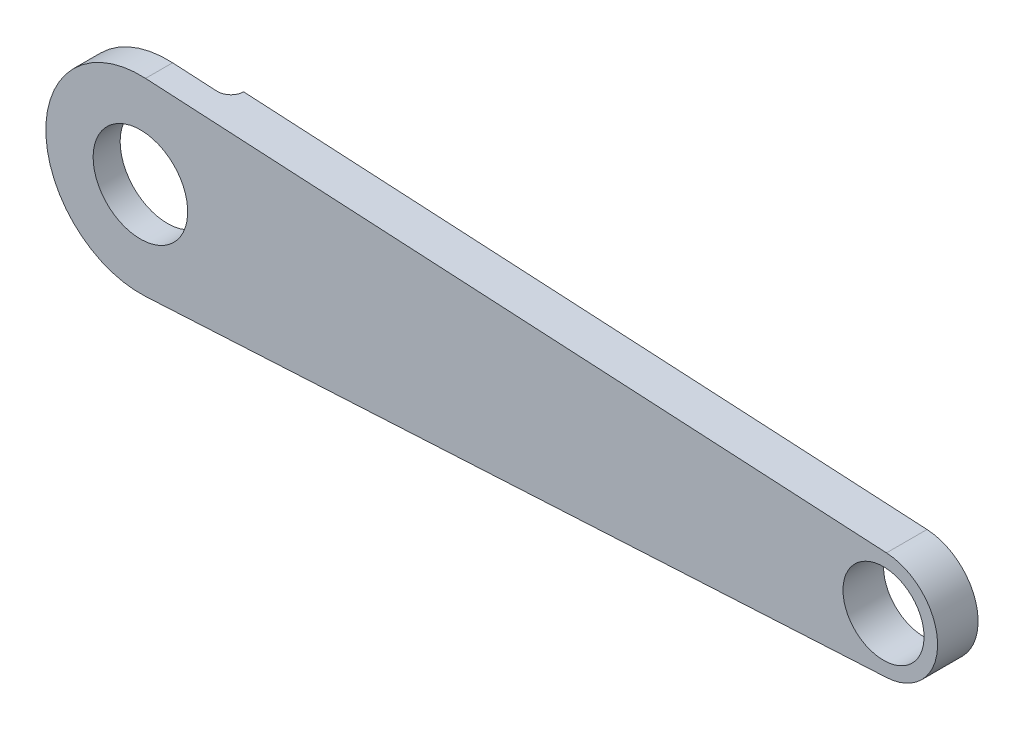
ISO-10303-21;
HEADER;
FILE_DESCRIPTION(('STEP AP214'),'2;1');
FILE_NAME('part.step','',(''),(''),'','','');
FILE_SCHEMA(('AUTOMOTIVE_DESIGN { 1 0 10303 214 1 1 1 1 }'));
ENDSEC;
DATA;
#1=APPLICATION_CONTEXT('core data for automotive mechanical design processes');
#2=APPLICATION_PROTOCOL_DEFINITION('international standard','automotive_design',2000,#1);
#3=PRODUCT_CONTEXT('',#1,'mechanical');
#4=PRODUCT('Part','Part','',(#3));
#5=PRODUCT_RELATED_PRODUCT_CATEGORY('part','',(#4));
#6=PRODUCT_DEFINITION_FORMATION('','',#4);
#7=PRODUCT_DEFINITION_CONTEXT('part definition',#1,'design');
#8=PRODUCT_DEFINITION('design','',#6,#7);
#9=PRODUCT_DEFINITION_SHAPE('','',#8);
#10=(LENGTH_UNIT() NAMED_UNIT(*) SI_UNIT(.MILLI.,.METRE.));
#11=(NAMED_UNIT(*) PLANE_ANGLE_UNIT() SI_UNIT($,.RADIAN.));
#12=(NAMED_UNIT(*) SI_UNIT($,.STERADIAN.) SOLID_ANGLE_UNIT());
#13=UNCERTAINTY_MEASURE_WITH_UNIT(LENGTH_MEASURE(1.E-05),#10,'distance_accuracy_value','');
#14=(GEOMETRIC_REPRESENTATION_CONTEXT(3) GLOBAL_UNCERTAINTY_ASSIGNED_CONTEXT((#13)) GLOBAL_UNIT_ASSIGNED_CONTEXT((#10,
#11,#12)) REPRESENTATION_CONTEXT('',''));
#15=CARTESIAN_POINT('',(0.,0.,0.));
#16=DIRECTION('',(0.,0.,1.));
#17=DIRECTION('',(1.,0.,0.));
#18=AXIS2_PLACEMENT_3D('',#15,#16,#17);
#19=CARTESIAN_POINT('',(698.5,0.,38.1));
#20=DIRECTION('',(0.,0.,1.));
#21=DIRECTION('',(1.,0.,0.));
#22=AXIS2_PLACEMENT_3D('',#19,#20,#21);
#23=PLANE('',#22);
#24=CARTESIAN_POINT('',(-698.5,0.,38.1));
#25=DIRECTION('',(0.,0.,1.));
#26=DIRECTION('',(1.,0.,0.));
#27=AXIS2_PLACEMENT_3D('',#24,#25,#26);
#28=CIRCLE('',#27,88.8999999999999);
#29=CARTESIAN_POINT('',(-787.4,0.,38.1));
#30=VERTEX_POINT('',#29);
#31=EDGE_CURVE('E126',#30,#30,#28,.T.);
#32=ORIENTED_EDGE('',*,*,#31,.F.);
#33=EDGE_LOOP('',(#32));
#34=FACE_BOUND('',#33,.T.);
#35=CARTESIAN_POINT('',(698.5,0.,38.1));
#36=DIRECTION('',(0.,0.,1.));
#37=DIRECTION('',(1.,0.,0.));
#38=AXIS2_PLACEMENT_3D('',#35,#36,#37);
#39=CIRCLE('',#38,101.6);
#40=CARTESIAN_POINT('',(704.041818181818,-101.448746918035,38.1));
#41=VERTEX_POINT('',#40);
#42=CARTESIAN_POINT('',(704.041818181818,101.448746918036,38.1));
#43=VERTEX_POINT('',#42);
#44=EDGE_CURVE('E123',#41,#43,#39,.T.);
#45=ORIENTED_EDGE('',*,*,#44,.T.);
#46=DIRECTION('',(-0.998511288563344,0.0545454545454544,0.));
#47=VECTOR('',#46,1.);
#48=CARTESIAN_POINT('',(-688.801818181818,177.535307106563,38.1));
#49=LINE('',#48,#47);
#50=CARTESIAN_POINT('',(-688.801818181818,177.535307106563,38.1));
#51=VERTEX_POINT('',#50);
#52=EDGE_CURVE('E130',#43,#51,#49,.T.);
#53=ORIENTED_EDGE('',*,*,#52,.T.);
#54=CARTESIAN_POINT('',(-698.5,0.,38.1));
#55=DIRECTION('',(0.,0.,1.));
#56=DIRECTION('',(1.,0.,0.));
#57=AXIS2_PLACEMENT_3D('',#54,#55,#56);
#58=CIRCLE('',#57,177.8);
#59=CARTESIAN_POINT('',(-688.801818181818,-177.535307106562,38.1));
#60=VERTEX_POINT('',#59);
#61=EDGE_CURVE('E128',#51,#60,#58,.T.);
#62=ORIENTED_EDGE('',*,*,#61,.T.);
#63=DIRECTION('',(0.998511288563344,0.0545454545454547,0.));
#64=VECTOR('',#63,1.);
#65=CARTESIAN_POINT('',(-688.801818181818,-177.535307106562,38.1));
#66=LINE('',#65,#64);
#67=EDGE_CURVE('E122',#60,#41,#66,.T.);
#68=ORIENTED_EDGE('',*,*,#67,.T.);
#69=EDGE_LOOP('',(#45,#53,#62,#68));
#70=FACE_BOUND('',#69,.T.);
#71=CARTESIAN_POINT('',(698.5,0.,38.1));
#72=DIRECTION('',(0.,0.,1.));
#73=DIRECTION('',(1.,0.,0.));
#74=AXIS2_PLACEMENT_3D('',#71,#72,#73);
#75=CIRCLE('',#74,76.2000000000001);
#76=CARTESIAN_POINT('',(622.3,0.,38.1));
#77=VERTEX_POINT('',#76);
#78=EDGE_CURVE('E136',#77,#77,#75,.T.);
#79=ORIENTED_EDGE('',*,*,#78,.F.);
#80=EDGE_LOOP('',(#79));
#81=FACE_BOUND('',#80,.T.);
#82=ADVANCED_FACE('F37',(#34,#70,#81),#23,.T.);
#83=CARTESIAN_POINT('',(698.5,0.,-38.1));
#84=DIRECTION('',(0.,0.,1.));
#85=DIRECTION('',(1.,0.,0.));
#86=AXIS2_PLACEMENT_3D('',#83,#84,#85);
#87=PLANE('',#86);
#88=DIRECTION('',(0.998511288563344,0.0545454545454547,0.));
#89=VECTOR('',#88,1.);
#90=CARTESIAN_POINT('',(-688.801818181818,-177.535307106562,-38.1));
#91=LINE('',#90,#89);
#92=CARTESIAN_POINT('',(-561.990884534273,-170.60803437929,-38.1));
#93=VERTEX_POINT('',#92);
#94=CARTESIAN_POINT('',(704.041818181818,-101.448746918035,-38.1));
#95=VERTEX_POINT('',#94);
#96=EDGE_CURVE('E94',#93,#95,#91,.T.);
#97=ORIENTED_EDGE('',*,*,#96,.F.);
#98=DIRECTION('',(0.0545454545454547,-0.998511288563344,0.));
#99=VECTOR('',#98,1.);
#100=CARTESIAN_POINT('',(-581.901802111987,193.88202501573,-38.1));
#101=LINE('',#100,#99);
#102=CARTESIAN_POINT('',(-580.686207421409,171.629299633306,-38.1));
#103=VERTEX_POINT('',#102);
#104=EDGE_CURVE('E88',#103,#93,#101,.T.);
#105=ORIENTED_EDGE('',*,*,#104,.F.);
#106=DIRECTION('',(-0.998511288563344,0.0545454545454544,0.));
#107=VECTOR('',#106,1.);
#108=CARTESIAN_POINT('',(-688.801818181818,177.535307106563,-38.1));
#109=LINE('',#108,#107);
#110=CARTESIAN_POINT('',(704.041818181818,101.448746918036,-38.1));
#111=VERTEX_POINT('',#110);
#112=EDGE_CURVE('E92',#111,#103,#109,.T.);
#113=ORIENTED_EDGE('',*,*,#112,.F.);
#114=CARTESIAN_POINT('',(698.5,0.,-38.1));
#115=DIRECTION('',(0.,0.,1.));
#116=DIRECTION('',(1.,0.,0.));
#117=AXIS2_PLACEMENT_3D('',#114,#115,#116);
#118=CIRCLE('',#117,101.6);
#119=EDGE_CURVE('E101',#95,#111,#118,.T.);
#120=ORIENTED_EDGE('',*,*,#119,.F.);
#121=EDGE_LOOP('',(#97,#105,#113,#120));
#122=FACE_BOUND('',#121,.T.);
#123=CARTESIAN_POINT('',(698.5,0.,-38.1));
#124=DIRECTION('',(0.,0.,1.));
#125=DIRECTION('',(1.,0.,0.));
#126=AXIS2_PLACEMENT_3D('',#123,#124,#125);
#127=CIRCLE('',#126,76.2000000000001);
#128=CARTESIAN_POINT('',(622.3,0.,-38.1));
#129=VERTEX_POINT('',#128);
#130=EDGE_CURVE('E137',#129,#129,#127,.T.);
#131=ORIENTED_EDGE('',*,*,#130,.T.);
#132=EDGE_LOOP('',(#131));
#133=FACE_BOUND('',#132,.T.);
#134=ADVANCED_FACE('F89',(#122,#133),#87,.F.);
#135=CARTESIAN_POINT('',(698.5,0.,38.1));
#136=DIRECTION('',(0.,0.,-1.));
#137=DIRECTION('',(-1.,0.,0.));
#138=AXIS2_PLACEMENT_3D('',#135,#136,#137);
#139=CYLINDRICAL_SURFACE('',#138,101.6);
#140=ORIENTED_EDGE('',*,*,#119,.T.);
#141=DIRECTION('',(0.,0.,-1.));
#142=VECTOR('',#141,1.);
#143=CARTESIAN_POINT('',(704.041818181818,101.448746918036,38.1));
#144=LINE('',#143,#142);
#145=EDGE_CURVE('E99',#43,#111,#144,.T.);
#146=ORIENTED_EDGE('',*,*,#145,.F.);
#147=ORIENTED_EDGE('',*,*,#44,.F.);
#148=DIRECTION('',(0.,0.,-1.));
#149=VECTOR('',#148,1.);
#150=CARTESIAN_POINT('',(704.041818181818,-101.448746918035,38.1));
#151=LINE('',#150,#149);
#152=EDGE_CURVE('E119',#41,#95,#151,.T.);
#153=ORIENTED_EDGE('',*,*,#152,.T.);
#154=EDGE_LOOP('',(#140,#146,#147,#153));
#155=FACE_BOUND('',#154,.T.);
#156=ADVANCED_FACE('F161',(#155),#139,.T.);
#157=CARTESIAN_POINT('',(-688.801818181818,177.535307106563,38.1));
#158=DIRECTION('',(-0.0545454545454544,-0.998511288563344,0.));
#159=DIRECTION('',(0.998511288563344,-0.0545454545454544,0.));
#160=AXIS2_PLACEMENT_3D('',#157,#158,#159);
#161=PLANE('',#160);
#162=ORIENTED_EDGE('',*,*,#112,.T.);
#163=CARTESIAN_POINT('',(-606.20021302725,173.023047554823,-38.1));
#164=DIRECTION('',(-0.0545454545454544,-0.998511288563344,0.));
#165=DIRECTION('',(-0.998511288563344,0.0545454545454544,0.));
#166=AXIS2_PLACEMENT_3D('',#163,#164,#165);
#167=ELLIPSE('',#166,25.5520452278018,25.4);
#168=CARTESIAN_POINT('',(-606.20021302725,173.023047554823,-12.7));
#169=VERTEX_POINT('',#168);
#170=EDGE_CURVE('E11',#103,#169,#167,.T.);
#171=ORIENTED_EDGE('',*,*,#170,.T.);
#172=DIRECTION('',(-0.998511288563344,0.0545454545454544,0.));
#173=VECTOR('',#172,1.);
#174=CARTESIAN_POINT('',(-688.801818181818,177.535307106563,-12.7));
#175=LINE('',#174,#173);
#176=CARTESIAN_POINT('',(-688.801818181818,177.535307106563,-12.7));
#177=VERTEX_POINT('',#176);
#178=EDGE_CURVE('E140',#169,#177,#175,.T.);
#179=ORIENTED_EDGE('',*,*,#178,.T.);
#180=DIRECTION('',(0.,0.,-1.));
#181=VECTOR('',#180,1.);
#182=CARTESIAN_POINT('',(-688.801818181818,177.535307106563,38.1));
#183=LINE('',#182,#181);
#184=EDGE_CURVE('E108',#51,#177,#183,.T.);
#185=ORIENTED_EDGE('',*,*,#184,.F.);
#186=ORIENTED_EDGE('',*,*,#52,.F.);
#187=ORIENTED_EDGE('',*,*,#145,.T.);
#188=EDGE_LOOP('',(#162,#171,#179,#185,#186,#187));
#189=FACE_BOUND('',#188,.T.);
#190=ADVANCED_FACE('F97',(#189),#161,.F.);
#191=CARTESIAN_POINT('',(-698.5,0.,38.1));
#192=DIRECTION('',(0.,0.,-1.));
#193=DIRECTION('',(-1.,0.,0.));
#194=AXIS2_PLACEMENT_3D('',#191,#192,#193);
#195=CYLINDRICAL_SURFACE('',#194,177.8);
#196=ORIENTED_EDGE('',*,*,#184,.T.);
#197=CARTESIAN_POINT('',(-698.5,0.,-12.7));
#198=DIRECTION('',(0.,0.,1.));
#199=DIRECTION('',(1.,0.,0.));
#200=AXIS2_PLACEMENT_3D('',#197,#198,#199);
#201=CIRCLE('',#200,177.8);
#202=CARTESIAN_POINT('',(-688.801818181818,-177.535307106562,-12.7));
#203=VERTEX_POINT('',#202);
#204=EDGE_CURVE('E144',#177,#203,#201,.T.);
#205=ORIENTED_EDGE('',*,*,#204,.T.);
#206=DIRECTION('',(0.,0.,-1.));
#207=VECTOR('',#206,1.);
#208=CARTESIAN_POINT('',(-688.801818181818,-177.535307106562,38.1));
#209=LINE('',#208,#207);
#210=EDGE_CURVE('E116',#60,#203,#209,.T.);
#211=ORIENTED_EDGE('',*,*,#210,.F.);
#212=ORIENTED_EDGE('',*,*,#61,.F.);
#213=EDGE_LOOP('',(#196,#205,#211,#212));
#214=FACE_BOUND('',#213,.T.);
#215=ADVANCED_FACE('F155',(#214),#195,.T.);
#216=CARTESIAN_POINT('',(-688.801818181818,-177.535307106562,38.1));
#217=DIRECTION('',(-0.0545454545454547,0.998511288563344,0.));
#218=DIRECTION('',(-0.998511288563344,-0.0545454545454547,0.));
#219=AXIS2_PLACEMENT_3D('',#216,#217,#218);
#220=PLANE('',#219);
#221=ORIENTED_EDGE('',*,*,#210,.T.);
#222=DIRECTION('',(0.998511288563344,0.0545454545454547,0.));
#223=VECTOR('',#222,1.);
#224=CARTESIAN_POINT('',(-688.801818181818,-177.535307106562,-12.7));
#225=LINE('',#224,#223);
#226=CARTESIAN_POINT('',(-587.353071263782,-171.993488924744,-12.7));
#227=VERTEX_POINT('',#226);
#228=EDGE_CURVE('E112',#203,#227,#225,.T.);
#229=ORIENTED_EDGE('',*,*,#228,.T.);
#230=CARTESIAN_POINT('',(-587.353071263782,-171.993488924744,-38.1));
#231=DIRECTION('',(-0.0545454545454547,0.998511288563344,0.));
#232=DIRECTION('',(-0.998511288563344,-0.0545454545454547,0.));
#233=AXIS2_PLACEMENT_3D('',#230,#231,#232);
#234=CIRCLE('',#233,25.4);
#235=EDGE_CURVE('E45',#227,#93,#234,.T.);
#236=ORIENTED_EDGE('',*,*,#235,.T.);
#237=ORIENTED_EDGE('',*,*,#96,.T.);
#238=ORIENTED_EDGE('',*,*,#152,.F.);
#239=ORIENTED_EDGE('',*,*,#67,.F.);
#240=EDGE_LOOP('',(#221,#229,#236,#237,#238,#239));
#241=FACE_BOUND('',#240,.T.);
#242=ADVANCED_FACE('F147',(#241),#220,.F.);
#243=CARTESIAN_POINT('',(-698.5,0.,38.1));
#244=DIRECTION('',(0.,0.,-1.));
#245=DIRECTION('',(-1.,0.,0.));
#246=AXIS2_PLACEMENT_3D('',#243,#244,#245);
#247=CYLINDRICAL_SURFACE('',#246,88.8999999999999);
#248=CARTESIAN_POINT('',(-698.5,0.,-12.7));
#249=DIRECTION('',(0.,0.,1.));
#250=DIRECTION('',(1.,0.,0.));
#251=AXIS2_PLACEMENT_3D('',#248,#249,#250);
#252=CIRCLE('',#251,88.8999999999999);
#253=CARTESIAN_POINT('',(-787.4,0.,-12.7));
#254=VERTEX_POINT('',#253);
#255=EDGE_CURVE('E95',#254,#254,#252,.T.);
#256=CARTESIAN_POINT('',(-787.4,0.,-12.7));
#257=CARTESIAN_POINT('',(-787.4,0.,-12.1708333333333));
#258=CARTESIAN_POINT('',(-787.4,0.,-11.6416666666667));
#259=CARTESIAN_POINT('',(-787.4,0.,-10.5833333333333));
#260=CARTESIAN_POINT('',(-787.4,0.,-10.0541666666667));
#261=CARTESIAN_POINT('',(-787.4,0.,-8.99583333333334));
#262=CARTESIAN_POINT('',(-787.4,0.,-8.46666666666667));
#263=CARTESIAN_POINT('',(-787.4,0.,-7.40833333333333));
#264=CARTESIAN_POINT('',(-787.4,0.,-6.87916666666667));
#265=CARTESIAN_POINT('',(-787.4,0.,-5.82083333333333));
#266=CARTESIAN_POINT('',(-787.4,0.,-5.29166666666667));
#267=CARTESIAN_POINT('',(-787.4,0.,-4.23333333333334));
#268=CARTESIAN_POINT('',(-787.4,0.,-3.70416666666667));
#269=CARTESIAN_POINT('',(-787.4,0.,-2.64583333333334));
#270=CARTESIAN_POINT('',(-787.4,0.,-2.11666666666667));
#271=CARTESIAN_POINT('',(-787.4,0.,-1.05833333333334));
#272=CARTESIAN_POINT('',(-787.4,0.,-0.529166666666669));
#273=CARTESIAN_POINT('',(-787.4,0.,0.529166666666666));
#274=CARTESIAN_POINT('',(-787.4,0.,1.05833333333333));
#275=CARTESIAN_POINT('',(-787.4,0.,2.11666666666666));
#276=CARTESIAN_POINT('',(-787.4,0.,2.64583333333333));
#277=CARTESIAN_POINT('',(-787.4,0.,3.70416666666667));
#278=CARTESIAN_POINT('',(-787.4,0.,4.23333333333333));
#279=CARTESIAN_POINT('',(-787.4,0.,5.29166666666667));
#280=CARTESIAN_POINT('',(-787.4,0.,5.82083333333333));
#281=CARTESIAN_POINT('',(-787.4,0.,6.87916666666666));
#282=CARTESIAN_POINT('',(-787.4,0.,7.40833333333333));
#283=CARTESIAN_POINT('',(-787.4,0.,8.46666666666666));
#284=CARTESIAN_POINT('',(-787.4,0.,8.99583333333333));
#285=CARTESIAN_POINT('',(-787.4,0.,10.0541666666667));
#286=CARTESIAN_POINT('',(-787.4,0.,10.5833333333333));
#287=CARTESIAN_POINT('',(-787.4,0.,11.6416666666667));
#288=CARTESIAN_POINT('',(-787.4,0.,12.1708333333333));
#289=CARTESIAN_POINT('',(-787.4,0.,13.2291666666667));
#290=CARTESIAN_POINT('',(-787.4,0.,13.7583333333333));
#291=CARTESIAN_POINT('',(-787.4,0.,14.8166666666667));
#292=CARTESIAN_POINT('',(-787.4,0.,15.3458333333333));
#293=CARTESIAN_POINT('',(-787.4,0.,16.4041666666667));
#294=CARTESIAN_POINT('',(-787.4,0.,16.9333333333333));
#295=CARTESIAN_POINT('',(-787.4,0.,17.9916666666667));
#296=CARTESIAN_POINT('',(-787.4,0.,18.5208333333333));
#297=CARTESIAN_POINT('',(-787.4,0.,19.5791666666667));
#298=CARTESIAN_POINT('',(-787.4,0.,20.1083333333333));
#299=CARTESIAN_POINT('',(-787.4,0.,21.1666666666667));
#300=CARTESIAN_POINT('',(-787.4,0.,21.6958333333333));
#301=CARTESIAN_POINT('',(-787.4,0.,22.7541666666667));
#302=CARTESIAN_POINT('',(-787.4,0.,23.2833333333333));
#303=CARTESIAN_POINT('',(-787.4,0.,24.3416666666667));
#304=CARTESIAN_POINT('',(-787.4,0.,24.8708333333333));
#305=CARTESIAN_POINT('',(-787.4,0.,25.9291666666667));
#306=CARTESIAN_POINT('',(-787.4,0.,26.4583333333333));
#307=CARTESIAN_POINT('',(-787.4,0.,27.5166666666667));
#308=CARTESIAN_POINT('',(-787.4,0.,28.0458333333333));
#309=CARTESIAN_POINT('',(-787.4,0.,29.1041666666667));
#310=CARTESIAN_POINT('',(-787.4,0.,29.6333333333333));
#311=CARTESIAN_POINT('',(-787.4,0.,30.6916666666667));
#312=CARTESIAN_POINT('',(-787.4,0.,31.2208333333333));
#313=CARTESIAN_POINT('',(-787.4,0.,32.2791666666667));
#314=CARTESIAN_POINT('',(-787.4,0.,32.8083333333333));
#315=CARTESIAN_POINT('',(-787.4,0.,33.8666666666667));
#316=CARTESIAN_POINT('',(-787.4,0.,34.3958333333333));
#317=CARTESIAN_POINT('',(-787.4,0.,35.4541666666667));
#318=CARTESIAN_POINT('',(-787.4,0.,35.9833333333333));
#319=CARTESIAN_POINT('',(-787.4,0.,37.0416666666667));
#320=CARTESIAN_POINT('',(-787.4,0.,37.5708333333333));
#321=CARTESIAN_POINT('',(-787.4,0.,38.1));
#322=B_SPLINE_CURVE_WITH_KNOTS('',3,(#256,#257,#258,#259,#260,#261,#262,#263,#264,#265,#266,
#267,#268,#269,#270,#271,#272,#273,#274,#275,#276,#277,#278,#279,#280,#281,#282,#283,#284,#285,
#286,#287,#288,#289,#290,#291,#292,#293,#294,#295,#296,#297,#298,#299,#300,#301,#302,#303,#304,
#305,#306,#307,#308,#309,#310,#311,#312,#313,#314,#315,#316,#317,#318,#319,#320,#321),
.UNSPECIFIED.,.F.,.F.,(4,2,2,2,2,2,2,2,2,2,2,2,2,2,2,2,2,2,2,2,2,2,2,2,2,2,2,2,2,2,2,2,4),(0.,
1.5875,3.175,4.7625,6.35,7.9375,9.525,11.1125,12.7,14.2875,15.875,17.4625,19.05,20.6375,22.225,
23.8125,25.4,26.9875,28.575,30.1625,31.75,33.3375,34.925,36.5125,38.1,39.6875,41.275,42.8625,
44.45,46.0375,47.625,49.2125,50.8),.UNSPECIFIED.);
#323=EDGE_CURVE('BSEAM176',#254,#30,#322,.T.);
#324=ORIENTED_EDGE('',*,*,#255,.F.);
#325=ORIENTED_EDGE('',*,*,#31,.T.);
#326=ORIENTED_EDGE('',*,*,#323,.T.);
#327=ORIENTED_EDGE('',*,*,#323,.F.);
#328=EDGE_LOOP('',(#324,#326,#325,#327));
#329=FACE_BOUND('',#328,.T.);
#330=ADVANCED_FACE('F176',(#329),#247,.F.);
#331=CARTESIAN_POINT('',(698.5,0.,38.1));
#332=DIRECTION('',(0.,0.,-1.));
#333=DIRECTION('',(-1.,0.,0.));
#334=AXIS2_PLACEMENT_3D('',#331,#332,#333);
#335=CYLINDRICAL_SURFACE('',#334,76.2000000000001);
#336=CARTESIAN_POINT('',(622.3,0.,38.1));
#337=CARTESIAN_POINT('',(622.3,0.,37.30625));
#338=CARTESIAN_POINT('',(622.3,0.,36.5125));
#339=CARTESIAN_POINT('',(622.3,0.,34.925));
#340=CARTESIAN_POINT('',(622.3,0.,34.13125));
#341=CARTESIAN_POINT('',(622.3,0.,32.54375));
#342=CARTESIAN_POINT('',(622.3,0.,31.75));
#343=CARTESIAN_POINT('',(622.3,0.,30.1625));
#344=CARTESIAN_POINT('',(622.3,0.,29.36875));
#345=CARTESIAN_POINT('',(622.3,0.,27.78125));
#346=CARTESIAN_POINT('',(622.3,0.,26.9875));
#347=CARTESIAN_POINT('',(622.3,0.,25.4));
#348=CARTESIAN_POINT('',(622.3,0.,24.60625));
#349=CARTESIAN_POINT('',(622.3,0.,23.01875));
#350=CARTESIAN_POINT('',(622.3,0.,22.225));
#351=CARTESIAN_POINT('',(622.3,0.,20.6375));
#352=CARTESIAN_POINT('',(622.3,0.,19.84375));
#353=CARTESIAN_POINT('',(622.3,0.,18.25625));
#354=CARTESIAN_POINT('',(622.3,0.,17.4625));
#355=CARTESIAN_POINT('',(622.3,0.,15.875));
#356=CARTESIAN_POINT('',(622.3,0.,15.08125));
#357=CARTESIAN_POINT('',(622.3,0.,13.49375));
#358=CARTESIAN_POINT('',(622.3,0.,12.7));
#359=CARTESIAN_POINT('',(622.3,0.,11.1125));
#360=CARTESIAN_POINT('',(622.3,0.,10.31875));
#361=CARTESIAN_POINT('',(622.3,0.,8.73124999999999));
#362=CARTESIAN_POINT('',(622.3,0.,7.93749999999999));
#363=CARTESIAN_POINT('',(622.3,0.,6.35));
#364=CARTESIAN_POINT('',(622.3,0.,5.55625));
#365=CARTESIAN_POINT('',(622.3,0.,3.96875));
#366=CARTESIAN_POINT('',(622.3,0.,3.175));
#367=CARTESIAN_POINT('',(622.3,0.,1.5875));
#368=CARTESIAN_POINT('',(622.3,0.,0.793750000000001));
#369=CARTESIAN_POINT('',(622.3,0.,-0.793750000000001));
#370=CARTESIAN_POINT('',(622.3,0.,-1.5875));
#371=CARTESIAN_POINT('',(622.3,0.,-3.175));
#372=CARTESIAN_POINT('',(622.3,0.,-3.96875));
#373=CARTESIAN_POINT('',(622.3,0.,-5.55625));
#374=CARTESIAN_POINT('',(622.3,0.,-6.35));
#375=CARTESIAN_POINT('',(622.3,0.,-7.93750000000001));
#376=CARTESIAN_POINT('',(622.3,0.,-8.73125));
#377=CARTESIAN_POINT('',(622.3,0.,-10.31875));
#378=CARTESIAN_POINT('',(622.3,0.,-11.1125));
#379=CARTESIAN_POINT('',(622.3,0.,-12.7));
#380=CARTESIAN_POINT('',(622.3,0.,-13.49375));
#381=CARTESIAN_POINT('',(622.3,0.,-15.08125));
#382=CARTESIAN_POINT('',(622.3,0.,-15.875));
#383=CARTESIAN_POINT('',(622.3,0.,-17.4625));
#384=CARTESIAN_POINT('',(622.3,0.,-18.25625));
#385=CARTESIAN_POINT('',(622.3,0.,-19.84375));
#386=CARTESIAN_POINT('',(622.3,0.,-20.6375));
#387=CARTESIAN_POINT('',(622.3,0.,-22.225));
#388=CARTESIAN_POINT('',(622.3,0.,-23.01875));
#389=CARTESIAN_POINT('',(622.3,0.,-24.60625));
#390=CARTESIAN_POINT('',(622.3,0.,-25.4));
#391=CARTESIAN_POINT('',(622.3,0.,-26.9875));
#392=CARTESIAN_POINT('',(622.3,0.,-27.78125));
#393=CARTESIAN_POINT('',(622.3,0.,-29.36875));
#394=CARTESIAN_POINT('',(622.3,0.,-30.1625));
#395=CARTESIAN_POINT('',(622.3,0.,-31.75));
#396=CARTESIAN_POINT('',(622.3,0.,-32.54375));
#397=CARTESIAN_POINT('',(622.3,0.,-34.13125));
#398=CARTESIAN_POINT('',(622.3,0.,-34.925));
#399=CARTESIAN_POINT('',(622.3,0.,-36.5125));
#400=CARTESIAN_POINT('',(622.3,0.,-37.30625));
#401=CARTESIAN_POINT('',(622.3,0.,-38.1));
#402=B_SPLINE_CURVE_WITH_KNOTS('',3,(#336,#337,#338,#339,#340,#341,#342,#343,#344,#345,#346,
#347,#348,#349,#350,#351,#352,#353,#354,#355,#356,#357,#358,#359,#360,#361,#362,#363,#364,#365,
#366,#367,#368,#369,#370,#371,#372,#373,#374,#375,#376,#377,#378,#379,#380,#381,#382,#383,#384,
#385,#386,#387,#388,#389,#390,#391,#392,#393,#394,#395,#396,#397,#398,#399,#400,#401),
.UNSPECIFIED.,.F.,.F.,(4,2,2,2,2,2,2,2,2,2,2,2,2,2,2,2,2,2,2,2,2,2,2,2,2,2,2,2,2,2,2,2,4),(0.,
2.38125,4.7625,7.14375,9.52500000000001,11.90625,14.2875,16.66875,19.05,21.43125,23.8125,
26.19375,28.575,30.95625,33.3375,35.71875,38.1,40.48125,42.8625,45.24375,47.625,50.00625,
52.3875,54.76875,57.15,59.53125,61.9125,64.29375,66.675,69.05625,71.4375,73.81875,76.2),.UNSPECIFIED.);
#403=EDGE_CURVE('BSEAM198',#77,#129,#402,.T.);
#404=ORIENTED_EDGE('',*,*,#78,.T.);
#405=ORIENTED_EDGE('',*,*,#130,.F.);
#406=ORIENTED_EDGE('',*,*,#403,.T.);
#407=ORIENTED_EDGE('',*,*,#403,.F.);
#408=EDGE_LOOP('',(#404,#406,#405,#407));
#409=FACE_BOUND('',#408,.T.);
#410=ADVANCED_FACE('F198',(#409),#335,.F.);
#411=CARTESIAN_POINT('',(-886.248042866094,177.256570470275,-12.7));
#412=DIRECTION('',(0.,0.,1.));
#413=DIRECTION('',(1.,0.,0.));
#414=AXIS2_PLACEMENT_3D('',#411,#412,#413);
#415=PLANE('',#414);
#416=ORIENTED_EDGE('',*,*,#255,.T.);
#417=EDGE_LOOP('',(#416));
#418=FACE_BOUND('',#417,.T.);
#419=ORIENTED_EDGE('',*,*,#178,.F.);
#420=DIRECTION('',(0.0545454545454547,-0.998511288563344,0.));
#421=VECTOR('',#420,1.);
#422=CARTESIAN_POINT('',(-587.353071263782,-171.993488924744,-12.7));
#423=LINE('',#422,#421);
#424=EDGE_CURVE('E103',#169,#227,#423,.T.);
#425=ORIENTED_EDGE('',*,*,#424,.T.);
#426=ORIENTED_EDGE('',*,*,#228,.F.);
#427=ORIENTED_EDGE('',*,*,#204,.F.);
#428=EDGE_LOOP('',(#419,#425,#426,#427));
#429=FACE_BOUND('',#428,.T.);
#430=ADVANCED_FACE('F151',(#418,#429),#415,.F.);
#431=CARTESIAN_POINT('',(-607.263988841496,192.496570470275,-38.1));
#432=DIRECTION('',(-0.0545454545454547,0.998511288563344,0.));
#433=DIRECTION('',(-0.998511288563344,-0.0545454545454547,0.));
#434=AXIS2_PLACEMENT_3D('',#431,#432,#433);
#435=CYLINDRICAL_SURFACE('',#434,25.4);
#436=ORIENTED_EDGE('',*,*,#170,.F.);
#437=ORIENTED_EDGE('',*,*,#104,.T.);
#438=ORIENTED_EDGE('',*,*,#235,.F.);
#439=ORIENTED_EDGE('',*,*,#424,.F.);
#440=EDGE_LOOP('',(#436,#437,#438,#439));
#441=FACE_BOUND('',#440,.T.);
#442=ADVANCED_FACE('F39',(#441),#435,.F.);
#443=CLOSED_SHELL('',(#82,#134,#156,#190,#215,#242,#330,#410,#430,#442));
#444=MANIFOLD_SOLID_BREP('B2',#443);
#445=ADVANCED_BREP_SHAPE_REPRESENTATION('',(#18,#444),#14);
#446=SHAPE_DEFINITION_REPRESENTATION(#9,#445);
ENDSEC;
END-ISO-10303-21;
